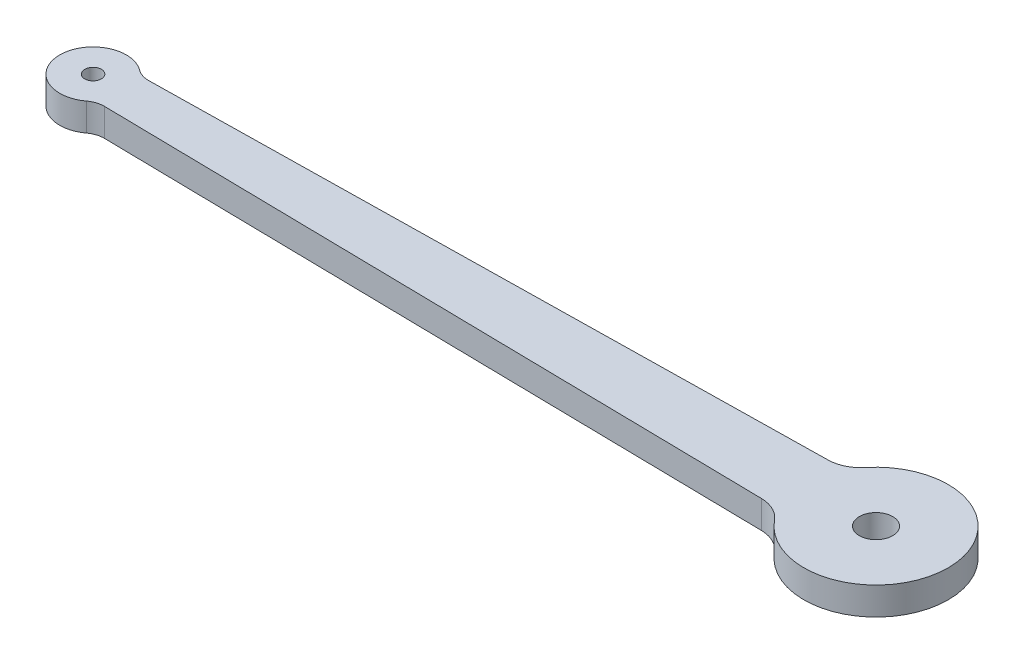
ISO-10303-21;
HEADER;
FILE_DESCRIPTION(('STEP AP214'),'2;1');
FILE_NAME('part.step','',(''),(''),'','','');
FILE_SCHEMA(('AUTOMOTIVE_DESIGN { 1 0 10303 214 1 1 1 1 }'));
ENDSEC;
DATA;
#1=APPLICATION_CONTEXT('core data for automotive mechanical design processes');
#2=APPLICATION_PROTOCOL_DEFINITION('international standard','automotive_design',2000,#1);
#3=PRODUCT_CONTEXT('',#1,'mechanical');
#4=PRODUCT('Part','Part','',(#3));
#5=PRODUCT_RELATED_PRODUCT_CATEGORY('part','',(#4));
#6=PRODUCT_DEFINITION_FORMATION('','',#4);
#7=PRODUCT_DEFINITION_CONTEXT('part definition',#1,'design');
#8=PRODUCT_DEFINITION('design','',#6,#7);
#9=PRODUCT_DEFINITION_SHAPE('','',#8);
#10=(LENGTH_UNIT() NAMED_UNIT(*) SI_UNIT(.MILLI.,.METRE.));
#11=(NAMED_UNIT(*) PLANE_ANGLE_UNIT() SI_UNIT($,.RADIAN.));
#12=(NAMED_UNIT(*) SI_UNIT($,.STERADIAN.) SOLID_ANGLE_UNIT());
#13=UNCERTAINTY_MEASURE_WITH_UNIT(LENGTH_MEASURE(1.E-05),#10,'distance_accuracy_value','');
#14=(GEOMETRIC_REPRESENTATION_CONTEXT(3) GLOBAL_UNCERTAINTY_ASSIGNED_CONTEXT((#13)) GLOBAL_UNIT_ASSIGNED_CONTEXT((#10,
#11,#12)) REPRESENTATION_CONTEXT('',''));
#15=CARTESIAN_POINT('',(0.,0.,0.));
#16=DIRECTION('',(0.,0.,1.));
#17=DIRECTION('',(1.,0.,0.));
#18=AXIS2_PLACEMENT_3D('',#15,#16,#17);
#19=CARTESIAN_POINT('',(-32.2496315918774,2.5,-3.99972366739756));
#20=DIRECTION('',(0.,-1.,0.));
#21=DIRECTION('',(0.,0.,-1.));
#22=AXIS2_PLACEMENT_3D('',#19,#20,#21);
#23=CYLINDRICAL_SURFACE('',#22,2.);
#24=CARTESIAN_POINT('',(-32.2496315918774,0.,-3.99972366739756));
#25=DIRECTION('',(0.,-1.,0.));
#26=DIRECTION('',(0.,0.,-1.));
#27=AXIS2_PLACEMENT_3D('',#24,#25,#26);
#28=CIRCLE('',#27,2.);
#29=CARTESIAN_POINT('',(-32.2163862305459,0.,-2.));
#30=VERTEX_POINT('',#29);
#31=CARTESIAN_POINT('',(-33.4497789551265,0.,-2.39983420043853));
#32=VERTEX_POINT('',#31);
#33=EDGE_CURVE('E131',#30,#32,#28,.T.);
#34=ORIENTED_EDGE('',*,*,#33,.T.);
#35=DIRECTION('',(0.,-1.,0.));
#36=VECTOR('',#35,1.);
#37=CARTESIAN_POINT('',(-33.4497789551265,2.5,-2.39983420043853));
#38=LINE('',#37,#36);
#39=CARTESIAN_POINT('',(-33.4497789551265,2.5,-2.39983420043853));
#40=VERTEX_POINT('',#39);
#41=EDGE_CURVE('E11',#40,#32,#38,.T.);
#42=ORIENTED_EDGE('',*,*,#41,.F.);
#43=CARTESIAN_POINT('',(-32.2496315918774,2.5,-3.99972366739756));
#44=DIRECTION('',(0.,-1.,0.));
#45=DIRECTION('',(0.,0.,-1.));
#46=AXIS2_PLACEMENT_3D('',#43,#44,#45);
#47=CIRCLE('',#46,2.);
#48=CARTESIAN_POINT('',(-32.2163862305459,2.5,-2.));
#49=VERTEX_POINT('',#48);
#50=EDGE_CURVE('E146',#49,#40,#47,.T.);
#51=ORIENTED_EDGE('',*,*,#50,.F.);
#52=DIRECTION('',(0.,-1.,0.));
#53=VECTOR('',#52,1.);
#54=CARTESIAN_POINT('',(-32.2163862305459,2.5,-2.));
#55=LINE('',#54,#53);
#56=EDGE_CURVE('E127',#49,#30,#55,.T.);
#57=ORIENTED_EDGE('',*,*,#56,.T.);
#58=EDGE_LOOP('',(#34,#42,#51,#57));
#59=FACE_BOUND('',#58,.T.);
#60=ADVANCED_FACE('F35',(#59),#23,.F.);
#61=CARTESIAN_POINT('',(-35.25,2.5,0.));
#62=DIRECTION('',(0.,-1.,0.));
#63=DIRECTION('',(0.,0.,-1.));
#64=AXIS2_PLACEMENT_3D('',#61,#62,#63);
#65=CYLINDRICAL_SURFACE('',#64,3.);
#66=CARTESIAN_POINT('',(-35.25,0.,0.));
#67=DIRECTION('',(0.,1.,0.));
#68=DIRECTION('',(0.,0.,1.));
#69=AXIS2_PLACEMENT_3D('',#66,#67,#68);
#70=CIRCLE('',#69,3.);
#71=CARTESIAN_POINT('',(-33.4497789551265,0.,2.39983420043853));
#72=VERTEX_POINT('',#71);
#73=EDGE_CURVE('E134',#32,#72,#70,.T.);
#74=ORIENTED_EDGE('',*,*,#73,.T.);
#75=DIRECTION('',(0.,-1.,0.));
#76=VECTOR('',#75,1.);
#77=CARTESIAN_POINT('',(-33.4497789551265,2.5,2.39983420043853));
#78=LINE('',#77,#76);
#79=CARTESIAN_POINT('',(-33.4497789551265,2.5,2.39983420043853));
#80=VERTEX_POINT('',#79);
#81=EDGE_CURVE('E43',#80,#72,#78,.T.);
#82=ORIENTED_EDGE('',*,*,#81,.F.);
#83=CARTESIAN_POINT('',(-35.25,2.5,0.));
#84=DIRECTION('',(0.,1.,0.));
#85=DIRECTION('',(0.,0.,1.));
#86=AXIS2_PLACEMENT_3D('',#83,#84,#85);
#87=CIRCLE('',#86,3.);
#88=EDGE_CURVE('E94',#40,#80,#87,.T.);
#89=ORIENTED_EDGE('',*,*,#88,.F.);
#90=ORIENTED_EDGE('',*,*,#41,.T.);
#91=EDGE_LOOP('',(#74,#82,#89,#90));
#92=FACE_BOUND('',#91,.T.);
#93=ADVANCED_FACE('F213',(#92),#65,.T.);
#94=CARTESIAN_POINT('',(-32.2496315918774,2.5,3.99972366739756));
#95=DIRECTION('',(0.,-1.,0.));
#96=DIRECTION('',(0.,0.,-1.));
#97=AXIS2_PLACEMENT_3D('',#94,#95,#96);
#98=CYLINDRICAL_SURFACE('',#97,2.);
#99=CARTESIAN_POINT('',(-32.2496315918774,0.,3.99972366739756));
#100=DIRECTION('',(0.,-1.,0.));
#101=DIRECTION('',(0.,0.,1.));
#102=AXIS2_PLACEMENT_3D('',#99,#100,#101);
#103=CIRCLE('',#102,2.);
#104=CARTESIAN_POINT('',(-32.2163862305459,0.,2.));
#105=VERTEX_POINT('',#104);
#106=EDGE_CURVE('E137',#72,#105,#103,.T.);
#107=ORIENTED_EDGE('',*,*,#106,.T.);
#108=DIRECTION('',(0.,-1.,0.));
#109=VECTOR('',#108,1.);
#110=CARTESIAN_POINT('',(-32.2163862305459,2.5,2.));
#111=LINE('',#110,#109);
#112=CARTESIAN_POINT('',(-32.2163862305459,2.5,2.));
#113=VERTEX_POINT('',#112);
#114=EDGE_CURVE('E153',#113,#105,#111,.T.);
#115=ORIENTED_EDGE('',*,*,#114,.F.);
#116=CARTESIAN_POINT('',(-32.2496315918774,2.5,3.99972366739756));
#117=DIRECTION('',(0.,-1.,0.));
#118=DIRECTION('',(0.,0.,1.));
#119=AXIS2_PLACEMENT_3D('',#116,#117,#118);
#120=CIRCLE('',#119,2.);
#121=EDGE_CURVE('E161',#80,#113,#120,.T.);
#122=ORIENTED_EDGE('',*,*,#121,.F.);
#123=ORIENTED_EDGE('',*,*,#81,.T.);
#124=EDGE_LOOP('',(#107,#115,#122,#123));
#125=FACE_BOUND('',#124,.T.);
#126=ADVANCED_FACE('F159',(#125),#98,.F.);
#127=CARTESIAN_POINT('',(-32.2163862305459,2.5,2.));
#128=DIRECTION('',(0.016622680665795,0.,-0.999861833698778));
#129=DIRECTION('',(-0.999861833698778,0.,-0.016622680665795));
#130=AXIS2_PLACEMENT_3D('',#127,#128,#129);
#131=PLANE('',#130);
#132=DIRECTION('',(0.999861833698778,0.,0.016622680665795));
#133=VECTOR('',#132,1.);
#134=CARTESIAN_POINT('',(-32.2163862305459,0.,2.));
#135=LINE('',#134,#133);
#136=CARTESIAN_POINT('',(27.9340704738426,0.,3.));
#137=VERTEX_POINT('',#136);
#138=EDGE_CURVE('E139',#105,#137,#135,.T.);
#139=ORIENTED_EDGE('',*,*,#138,.T.);
#140=DIRECTION('',(0.,-1.,0.));
#141=VECTOR('',#140,1.);
#142=CARTESIAN_POINT('',(27.9340704738426,2.5,3.));
#143=LINE('',#142,#141);
#144=CARTESIAN_POINT('',(27.9340704738426,2.5,3.));
#145=VERTEX_POINT('',#144);
#146=EDGE_CURVE('E150',#145,#137,#143,.T.);
#147=ORIENTED_EDGE('',*,*,#146,.F.);
#148=DIRECTION('',(0.999861833698778,0.,0.016622680665795));
#149=VECTOR('',#148,1.);
#150=CARTESIAN_POINT('',(-32.2163862305459,2.5,2.));
#151=LINE('',#150,#149);
#152=EDGE_CURVE('E173',#113,#145,#151,.T.);
#153=ORIENTED_EDGE('',*,*,#152,.F.);
#154=ORIENTED_EDGE('',*,*,#114,.T.);
#155=EDGE_LOOP('',(#139,#147,#153,#154));
#156=FACE_BOUND('',#155,.T.);
#157=ADVANCED_FACE('F169',(#156),#131,.F.);
#158=CARTESIAN_POINT('',(27.8842024318452,2.5,5.99958550109633));
#159=DIRECTION('',(0.,-1.,0.));
#160=DIRECTION('',(0.,0.,-1.));
#161=AXIS2_PLACEMENT_3D('',#158,#159,#160);
#162=CYLINDRICAL_SURFACE('',#161,3.);
#163=CARTESIAN_POINT('',(27.8842024318452,0.,5.99958550109633));
#164=DIRECTION('',(0.,-1.,0.));
#165=DIRECTION('',(0.,0.,-1.));
#166=AXIS2_PLACEMENT_3D('',#163,#164,#165);
#167=CIRCLE('',#166,3.);
#168=CARTESIAN_POINT('',(30.2102437691573,0.,4.1049795533817));
#169=VERTEX_POINT('',#168);
#170=EDGE_CURVE('E141',#137,#169,#167,.T.);
#171=ORIENTED_EDGE('',*,*,#170,.T.);
#172=DIRECTION('',(0.,-1.,0.));
#173=VECTOR('',#172,1.);
#174=CARTESIAN_POINT('',(30.2102437691573,2.5,4.1049795533817));
#175=LINE('',#174,#173);
#176=CARTESIAN_POINT('',(30.2102437691573,2.5,4.1049795533817));
#177=VERTEX_POINT('',#176);
#178=EDGE_CURVE('E122',#177,#169,#175,.T.);
#179=ORIENTED_EDGE('',*,*,#178,.F.);
#180=CARTESIAN_POINT('',(27.8842024318452,2.5,5.99958550109633));
#181=DIRECTION('',(0.,-1.,0.));
#182=DIRECTION('',(0.,0.,-1.));
#183=AXIS2_PLACEMENT_3D('',#180,#181,#182);
#184=CIRCLE('',#183,3.);
#185=EDGE_CURVE('E113',#145,#177,#184,.T.);
#186=ORIENTED_EDGE('',*,*,#185,.F.);
#187=ORIENTED_EDGE('',*,*,#146,.T.);
#188=EDGE_LOOP('',(#171,#179,#186,#187));
#189=FACE_BOUND('',#188,.T.);
#190=ADVANCED_FACE('F172',(#189),#162,.F.);
#191=CARTESIAN_POINT('',(35.25,2.5,0.));
#192=DIRECTION('',(0.,-1.,0.));
#193=DIRECTION('',(0.,0.,-1.));
#194=AXIS2_PLACEMENT_3D('',#191,#192,#193);
#195=CYLINDRICAL_SURFACE('',#194,6.5);
#196=CARTESIAN_POINT('',(35.25,0.,0.));
#197=DIRECTION('',(0.,1.,0.));
#198=DIRECTION('',(0.,0.,1.));
#199=AXIS2_PLACEMENT_3D('',#196,#197,#198);
#200=CIRCLE('',#199,6.5);
#201=CARTESIAN_POINT('',(30.2102437691573,0.,-4.1049795533817));
#202=VERTEX_POINT('',#201);
#203=EDGE_CURVE('E121',#169,#202,#200,.T.);
#204=ORIENTED_EDGE('',*,*,#203,.T.);
#205=DIRECTION('',(0.,-1.,0.));
#206=VECTOR('',#205,1.);
#207=CARTESIAN_POINT('',(30.2102437691573,2.5,-4.1049795533817));
#208=LINE('',#207,#206);
#209=CARTESIAN_POINT('',(30.2102437691573,2.5,-4.1049795533817));
#210=VERTEX_POINT('',#209);
#211=EDGE_CURVE('E118',#210,#202,#208,.T.);
#212=ORIENTED_EDGE('',*,*,#211,.F.);
#213=CARTESIAN_POINT('',(35.25,2.5,0.));
#214=DIRECTION('',(0.,1.,0.));
#215=DIRECTION('',(0.,0.,1.));
#216=AXIS2_PLACEMENT_3D('',#213,#214,#215);
#217=CIRCLE('',#216,6.5);
#218=EDGE_CURVE('E107',#177,#210,#217,.T.);
#219=ORIENTED_EDGE('',*,*,#218,.F.);
#220=ORIENTED_EDGE('',*,*,#178,.T.);
#221=EDGE_LOOP('',(#204,#212,#219,#220));
#222=FACE_BOUND('',#221,.T.);
#223=ADVANCED_FACE('F119',(#222),#195,.T.);
#224=CARTESIAN_POINT('',(27.8842024318452,2.5,-5.99958550109633));
#225=DIRECTION('',(0.,-1.,0.));
#226=DIRECTION('',(0.,0.,-1.));
#227=AXIS2_PLACEMENT_3D('',#224,#225,#226);
#228=CYLINDRICAL_SURFACE('',#227,3.);
#229=CARTESIAN_POINT('',(27.8842024318452,0.,-5.99958550109633));
#230=DIRECTION('',(0.,-1.,0.));
#231=DIRECTION('',(0.,0.,1.));
#232=AXIS2_PLACEMENT_3D('',#229,#230,#231);
#233=CIRCLE('',#232,3.);
#234=CARTESIAN_POINT('',(27.9340704738426,0.,-3.));
#235=VERTEX_POINT('',#234);
#236=EDGE_CURVE('E80',#202,#235,#233,.T.);
#237=ORIENTED_EDGE('',*,*,#236,.T.);
#238=DIRECTION('',(0.,-1.,0.));
#239=VECTOR('',#238,1.);
#240=CARTESIAN_POINT('',(27.9340704738426,2.5,-3.));
#241=LINE('',#240,#239);
#242=CARTESIAN_POINT('',(27.9340704738426,2.5,-3.));
#243=VERTEX_POINT('',#242);
#244=EDGE_CURVE('E123',#243,#235,#241,.T.);
#245=ORIENTED_EDGE('',*,*,#244,.F.);
#246=CARTESIAN_POINT('',(27.8842024318452,2.5,-5.99958550109633));
#247=DIRECTION('',(0.,-1.,0.));
#248=DIRECTION('',(0.,0.,1.));
#249=AXIS2_PLACEMENT_3D('',#246,#247,#248);
#250=CIRCLE('',#249,3.);
#251=EDGE_CURVE('E111',#210,#243,#250,.T.);
#252=ORIENTED_EDGE('',*,*,#251,.F.);
#253=ORIENTED_EDGE('',*,*,#211,.T.);
#254=EDGE_LOOP('',(#237,#245,#252,#253));
#255=FACE_BOUND('',#254,.T.);
#256=ADVANCED_FACE('F125',(#255),#228,.F.);
#257=CARTESIAN_POINT('',(-32.2163862305459,2.5,-2.));
#258=DIRECTION('',(0.016622680665795,0.,0.999861833698778));
#259=DIRECTION('',(0.999861833698778,0.,-0.016622680665795));
#260=AXIS2_PLACEMENT_3D('',#257,#258,#259);
#261=PLANE('',#260);
#262=DIRECTION('',(-0.999861833698778,0.,0.016622680665795));
#263=VECTOR('',#262,1.);
#264=CARTESIAN_POINT('',(-32.2163862305459,0.,-2.));
#265=LINE('',#264,#263);
#266=EDGE_CURVE('E86',#235,#30,#265,.T.);
#267=ORIENTED_EDGE('',*,*,#266,.T.);
#268=ORIENTED_EDGE('',*,*,#56,.F.);
#269=DIRECTION('',(-0.999861833698778,0.,0.016622680665795));
#270=VECTOR('',#269,1.);
#271=CARTESIAN_POINT('',(-32.2163862305459,2.5,-2.));
#272=LINE('',#271,#270);
#273=EDGE_CURVE('E51',#243,#49,#272,.T.);
#274=ORIENTED_EDGE('',*,*,#273,.F.);
#275=ORIENTED_EDGE('',*,*,#244,.T.);
#276=EDGE_LOOP('',(#267,#268,#274,#275));
#277=FACE_BOUND('',#276,.T.);
#278=ADVANCED_FACE('F195',(#277),#261,.F.);
#279=CARTESIAN_POINT('',(-32.2496315918774,2.5,-3.99972366739756));
#280=DIRECTION('',(0.,-1.,0.));
#281=DIRECTION('',(0.,0.,-1.));
#282=AXIS2_PLACEMENT_3D('',#279,#280,#281);
#283=PLANE('',#282);
#284=CARTESIAN_POINT('',(35.25,2.5,0.));
#285=DIRECTION('',(0.,1.,0.));
#286=DIRECTION('',(0.,0.,1.));
#287=AXIS2_PLACEMENT_3D('',#284,#285,#286);
#288=CIRCLE('',#287,1.5);
#289=CARTESIAN_POINT('',(35.25,2.5,1.5));
#290=VERTEX_POINT('',#289);
#291=EDGE_CURVE('E182',#290,#290,#288,.T.);
#292=ORIENTED_EDGE('',*,*,#291,.F.);
#293=EDGE_LOOP('',(#292));
#294=FACE_BOUND('',#293,.T.);
#295=CARTESIAN_POINT('',(-35.25,2.5,0.));
#296=DIRECTION('',(0.,1.,0.));
#297=DIRECTION('',(0.,0.,1.));
#298=AXIS2_PLACEMENT_3D('',#295,#296,#297);
#299=CIRCLE('',#298,0.749999999999999);
#300=CARTESIAN_POINT('',(-35.25,2.5,0.749999999999999));
#301=VERTEX_POINT('',#300);
#302=EDGE_CURVE('E135',#301,#301,#299,.T.);
#303=ORIENTED_EDGE('',*,*,#302,.F.);
#304=EDGE_LOOP('',(#303));
#305=FACE_BOUND('',#304,.T.);
#306=ORIENTED_EDGE('',*,*,#50,.T.);
#307=ORIENTED_EDGE('',*,*,#88,.T.);
#308=ORIENTED_EDGE('',*,*,#121,.T.);
#309=ORIENTED_EDGE('',*,*,#152,.T.);
#310=ORIENTED_EDGE('',*,*,#185,.T.);
#311=ORIENTED_EDGE('',*,*,#218,.T.);
#312=ORIENTED_EDGE('',*,*,#251,.T.);
#313=ORIENTED_EDGE('',*,*,#273,.T.);
#314=EDGE_LOOP('',(#306,#307,#308,#309,#310,#311,#312,#313));
#315=FACE_BOUND('',#314,.T.);
#316=ADVANCED_FACE('F109',(#294,#305,#315),#283,.F.);
#317=CARTESIAN_POINT('',(-32.2496315918774,0.,-3.99972366739756));
#318=DIRECTION('',(0.,-1.,0.));
#319=DIRECTION('',(0.,0.,-1.));
#320=AXIS2_PLACEMENT_3D('',#317,#318,#319);
#321=PLANE('',#320);
#322=CARTESIAN_POINT('',(35.25,0.,0.));
#323=DIRECTION('',(0.,-1.,0.));
#324=DIRECTION('',(0.,0.,-1.));
#325=AXIS2_PLACEMENT_3D('',#322,#323,#324);
#326=CIRCLE('',#325,1.5);
#327=CARTESIAN_POINT('',(35.25,0.,-1.5));
#328=VERTEX_POINT('',#327);
#329=EDGE_CURVE('E185',#328,#328,#326,.F.);
#330=ORIENTED_EDGE('',*,*,#329,.T.);
#331=EDGE_LOOP('',(#330));
#332=FACE_BOUND('',#331,.T.);
#333=CARTESIAN_POINT('',(-35.25,0.,0.));
#334=DIRECTION('',(0.,-1.,0.));
#335=DIRECTION('',(0.,0.,-1.));
#336=AXIS2_PLACEMENT_3D('',#333,#334,#335);
#337=CIRCLE('',#336,0.749999999999999);
#338=CARTESIAN_POINT('',(-35.25,0.,-0.749999999999999));
#339=VERTEX_POINT('',#338);
#340=EDGE_CURVE('E179',#339,#339,#337,.F.);
#341=ORIENTED_EDGE('',*,*,#340,.T.);
#342=EDGE_LOOP('',(#341));
#343=FACE_BOUND('',#342,.T.);
#344=ORIENTED_EDGE('',*,*,#33,.F.);
#345=ORIENTED_EDGE('',*,*,#266,.F.);
#346=ORIENTED_EDGE('',*,*,#236,.F.);
#347=ORIENTED_EDGE('',*,*,#203,.F.);
#348=ORIENTED_EDGE('',*,*,#170,.F.);
#349=ORIENTED_EDGE('',*,*,#138,.F.);
#350=ORIENTED_EDGE('',*,*,#106,.F.);
#351=ORIENTED_EDGE('',*,*,#73,.F.);
#352=EDGE_LOOP('',(#344,#345,#346,#347,#348,#349,#350,#351));
#353=FACE_BOUND('',#352,.T.);
#354=ADVANCED_FACE('F165',(#332,#343,#353),#321,.T.);
#355=CARTESIAN_POINT('',(-35.25,-0.00100000000000013,0.));
#356=DIRECTION('',(0.,1.,0.));
#357=DIRECTION('',(0.,0.,1.));
#358=AXIS2_PLACEMENT_3D('',#355,#356,#357);
#359=CYLINDRICAL_SURFACE('',#358,0.749999999999999);
#360=ORIENTED_EDGE('',*,*,#340,.F.);
#361=EDGE_LOOP('',(#360));
#362=FACE_BOUND('',#361,.T.);
#363=ORIENTED_EDGE('',*,*,#302,.T.);
#364=EDGE_LOOP('',(#363));
#365=FACE_BOUND('',#364,.T.);
#366=ADVANCED_FACE('F199',(#362,#365),#359,.F.);
#367=CARTESIAN_POINT('',(35.25,-0.00100000000000013,0.));
#368=DIRECTION('',(0.,1.,0.));
#369=DIRECTION('',(0.,0.,1.));
#370=AXIS2_PLACEMENT_3D('',#367,#368,#369);
#371=CYLINDRICAL_SURFACE('',#370,1.5);
#372=ORIENTED_EDGE('',*,*,#329,.F.);
#373=EDGE_LOOP('',(#372));
#374=FACE_BOUND('',#373,.T.);
#375=ORIENTED_EDGE('',*,*,#291,.T.);
#376=EDGE_LOOP('',(#375));
#377=FACE_BOUND('',#376,.T.);
#378=ADVANCED_FACE('F191',(#374,#377),#371,.F.);
#379=CLOSED_SHELL('',(#60,#93,#126,#157,#190,#223,#256,#278,#316,#354,#366,#378));
#380=MANIFOLD_SOLID_BREP('B2',#379);
#381=ADVANCED_BREP_SHAPE_REPRESENTATION('',(#18,#380),#14);
#382=SHAPE_DEFINITION_REPRESENTATION(#9,#381);
ENDSEC;
END-ISO-10303-21;
